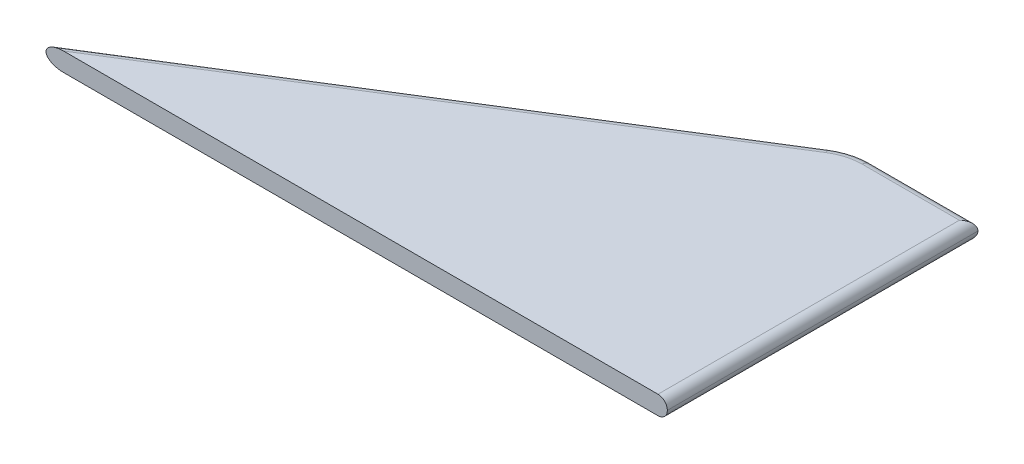
ISO-10303-21;
HEADER;
FILE_DESCRIPTION(('STEP AP214'),'2;1');
FILE_NAME('part.step','',(''),(''),'','','');
FILE_SCHEMA(('AUTOMOTIVE_DESIGN { 1 0 10303 214 1 1 1 1 }'));
ENDSEC;
DATA;
#1=APPLICATION_CONTEXT('core data for automotive mechanical design processes');
#2=APPLICATION_PROTOCOL_DEFINITION('international standard','automotive_design',2000,#1);
#3=PRODUCT_CONTEXT('',#1,'mechanical');
#4=PRODUCT('Part','Part','',(#3));
#5=PRODUCT_RELATED_PRODUCT_CATEGORY('part','',(#4));
#6=PRODUCT_DEFINITION_FORMATION('','',#4);
#7=PRODUCT_DEFINITION_CONTEXT('part definition',#1,'design');
#8=PRODUCT_DEFINITION('design','',#6,#7);
#9=PRODUCT_DEFINITION_SHAPE('','',#8);
#10=(LENGTH_UNIT() NAMED_UNIT(*) SI_UNIT(.MILLI.,.METRE.));
#11=(NAMED_UNIT(*) PLANE_ANGLE_UNIT() SI_UNIT($,.RADIAN.));
#12=(NAMED_UNIT(*) SI_UNIT($,.STERADIAN.) SOLID_ANGLE_UNIT());
#13=UNCERTAINTY_MEASURE_WITH_UNIT(LENGTH_MEASURE(1.E-05),#10,'distance_accuracy_value','');
#14=(GEOMETRIC_REPRESENTATION_CONTEXT(3) GLOBAL_UNCERTAINTY_ASSIGNED_CONTEXT((#13)) GLOBAL_UNIT_ASSIGNED_CONTEXT((#10,
#11,#12)) REPRESENTATION_CONTEXT('',''));
#15=CARTESIAN_POINT('',(0.,0.,0.));
#16=DIRECTION('',(0.,0.,1.));
#17=DIRECTION('',(1.,0.,0.));
#18=AXIS2_PLACEMENT_3D('',#15,#16,#17);
#19=CARTESIAN_POINT('',(0.,3.,0.));
#20=DIRECTION('',(0.,0.,-1.));
#21=DIRECTION('',(-1.,0.,0.));
#22=AXIS2_PLACEMENT_3D('',#19,#20,#21);
#23=PLANE('',#22);
#24=CARTESIAN_POINT('',(98.5,1.5,0.));
#25=DIRECTION('',(0.,0.,-1.));
#26=DIRECTION('',(-1.,0.,0.));
#27=AXIS2_PLACEMENT_3D('',#24,#25,#26);
#28=CIRCLE('',#27,1.5);
#29=CARTESIAN_POINT('',(98.5,0.,0.));
#30=VERTEX_POINT('',#29);
#31=CARTESIAN_POINT('',(100.,1.5,0.));
#32=VERTEX_POINT('',#31);
#33=EDGE_CURVE('E45',#30,#32,#28,.F.);
#34=ORIENTED_EDGE('',*,*,#33,.T.);
#35=CARTESIAN_POINT('',(98.5,1.5,0.));
#36=DIRECTION('',(0.,0.,-1.));
#37=DIRECTION('',(-1.,0.,0.));
#38=AXIS2_PLACEMENT_3D('',#35,#36,#37);
#39=CIRCLE('',#38,1.5);
#40=CARTESIAN_POINT('',(98.5,3.,0.));
#41=VERTEX_POINT('',#40);
#42=EDGE_CURVE('E11',#32,#41,#39,.F.);
#43=ORIENTED_EDGE('',*,*,#42,.T.);
#44=DIRECTION('',(1.,0.,0.));
#45=VECTOR('',#44,1.);
#46=CARTESIAN_POINT('',(0.,3.,0.));
#47=LINE('',#46,#45);
#48=CARTESIAN_POINT('',(2.83019433961698,3.,0.));
#49=VERTEX_POINT('',#48);
#50=EDGE_CURVE('E114',#49,#41,#47,.T.);
#51=ORIENTED_EDGE('',*,*,#50,.F.);
#52=CARTESIAN_POINT('',(2.83019433961698,1.5,0.));
#53=DIRECTION('',(0.,0.,-1.));
#54=DIRECTION('',(-1.,0.,0.));
#55=AXIS2_PLACEMENT_3D('',#52,#53,#54);
#56=ELLIPSE('',#55,2.83019433961698,1.5);
#57=CARTESIAN_POINT('',(0.,1.5,0.));
#58=VERTEX_POINT('',#57);
#59=EDGE_CURVE('E54',#49,#58,#56,.F.);
#60=ORIENTED_EDGE('',*,*,#59,.T.);
#61=CARTESIAN_POINT('',(2.83019433961698,1.5,0.));
#62=DIRECTION('',(0.,0.,-1.));
#63=DIRECTION('',(1.,0.,0.));
#64=AXIS2_PLACEMENT_3D('',#61,#62,#63);
#65=ELLIPSE('',#64,2.83019433961698,1.5);
#66=CARTESIAN_POINT('',(2.83019433961698,0.,0.));
#67=VERTEX_POINT('',#66);
#68=EDGE_CURVE('E81',#58,#67,#65,.F.);
#69=ORIENTED_EDGE('',*,*,#68,.T.);
#70=DIRECTION('',(1.,0.,0.));
#71=VECTOR('',#70,1.);
#72=CARTESIAN_POINT('',(0.,0.,0.));
#73=LINE('',#72,#71);
#74=EDGE_CURVE('E153',#67,#30,#73,.T.);
#75=ORIENTED_EDGE('',*,*,#74,.T.);
#76=EDGE_LOOP('',(#34,#43,#51,#60,#69,#75));
#77=FACE_BOUND('',#76,.T.);
#78=ADVANCED_FACE('F35',(#77),#23,.F.);
#79=CARTESIAN_POINT('',(0.,3.,0.));
#80=DIRECTION('',(0.,-1.,0.));
#81=DIRECTION('',(0.,0.,-1.));
#82=AXIS2_PLACEMENT_3D('',#79,#80,#81);
#83=PLANE('',#82);
#84=ORIENTED_EDGE('',*,*,#50,.T.);
#85=DIRECTION('',(0.,0.,-1.));
#86=VECTOR('',#85,1.);
#87=CARTESIAN_POINT('',(98.5,3.,0.));
#88=LINE('',#87,#86);
#89=CARTESIAN_POINT('',(98.5,3.,-48.5));
#90=VERTEX_POINT('',#89);
#91=EDGE_CURVE('E109',#41,#90,#88,.T.);
#92=ORIENTED_EDGE('',*,*,#91,.T.);
#93=DIRECTION('',(-1.,0.,0.));
#94=VECTOR('',#93,1.);
#95=CARTESIAN_POINT('',(0.,3.,-48.5));
#96=LINE('',#95,#94);
#97=CARTESIAN_POINT('',(82.8679622641132,3.,-48.5));
#98=VERTEX_POINT('',#97);
#99=EDGE_CURVE('E112',#90,#98,#96,.T.);
#100=ORIENTED_EDGE('',*,*,#99,.T.);
#101=CARTESIAN_POINT('',(82.8679622641132,3.,-40.));
#102=DIRECTION('',(0.,-1.,0.));
#103=DIRECTION('',(0.,0.,-1.));
#104=AXIS2_PLACEMENT_3D('',#101,#102,#103);
#105=CIRCLE('',#104,8.5);
#106=CARTESIAN_POINT('',(78.3629712740862,3.,-47.2079855840432));
#107=VERTEX_POINT('',#106);
#108=EDGE_CURVE('E125',#98,#107,#105,.F.);
#109=ORIENTED_EDGE('',*,*,#108,.T.);
#110=DIRECTION('',(-0.847998304005088,0.,0.52999894000318));
#111=VECTOR('',#110,1.);
#112=CARTESIAN_POINT('',(0.794998410004771,3.,1.27199745600763));
#113=LINE('',#112,#111);
#114=EDGE_CURVE('E127',#107,#49,#113,.T.);
#115=ORIENTED_EDGE('',*,*,#114,.T.);
#116=EDGE_LOOP('',(#84,#92,#100,#109,#115));
#117=FACE_BOUND('',#116,.T.);
#118=ADVANCED_FACE('F110',(#117),#83,.F.);
#119=CARTESIAN_POINT('',(0.,0.,0.));
#120=DIRECTION('',(0.,-1.,0.));
#121=DIRECTION('',(0.,0.,-1.));
#122=AXIS2_PLACEMENT_3D('',#119,#120,#121);
#123=PLANE('',#122);
#124=DIRECTION('',(-1.,0.,0.));
#125=VECTOR('',#124,1.);
#126=CARTESIAN_POINT('',(100.,0.,-48.5));
#127=LINE('',#126,#125);
#128=CARTESIAN_POINT('',(82.8679622641132,0.,-48.5));
#129=VERTEX_POINT('',#128);
#130=CARTESIAN_POINT('',(98.5,0.,-48.5));
#131=VERTEX_POINT('',#130);
#132=EDGE_CURVE('E163',#129,#131,#127,.F.);
#133=ORIENTED_EDGE('',*,*,#132,.T.);
#134=DIRECTION('',(0.,0.,-1.));
#135=VECTOR('',#134,1.);
#136=CARTESIAN_POINT('',(98.5,0.,0.));
#137=LINE('',#136,#135);
#138=EDGE_CURVE('E166',#131,#30,#137,.F.);
#139=ORIENTED_EDGE('',*,*,#138,.T.);
#140=ORIENTED_EDGE('',*,*,#74,.F.);
#141=DIRECTION('',(-0.847998304005088,0.,0.52999894000318));
#142=VECTOR('',#141,1.);
#143=CARTESIAN_POINT('',(78.3629712740862,0.,-47.2079855840432));
#144=LINE('',#143,#142);
#145=CARTESIAN_POINT('',(78.3629712740862,0.,-47.2079855840432));
#146=VERTEX_POINT('',#145);
#147=EDGE_CURVE('E157',#67,#146,#144,.F.);
#148=ORIENTED_EDGE('',*,*,#147,.T.);
#149=CARTESIAN_POINT('',(82.8679622641132,0.,-40.));
#150=DIRECTION('',(0.,-1.,0.));
#151=DIRECTION('',(0.,0.,-1.));
#152=AXIS2_PLACEMENT_3D('',#149,#150,#151);
#153=CIRCLE('',#152,8.5);
#154=EDGE_CURVE('E161',#146,#129,#153,.T.);
#155=ORIENTED_EDGE('',*,*,#154,.T.);
#156=EDGE_LOOP('',(#133,#139,#140,#148,#155));
#157=FACE_BOUND('',#156,.T.);
#158=ADVANCED_FACE('F171',(#157),#123,.T.);
#159=CARTESIAN_POINT('',(0.794998410004771,1.5,1.27199745600763));
#160=DIRECTION('',(-0.847998304005088,0.,0.52999894000318));
#161=DIRECTION('',(0.52999894000318,0.,0.847998304005088));
#162=AXIS2_PLACEMENT_3D('',#159,#160,#161);
#163=CYLINDRICAL_SURFACE('',#162,1.5);
#164=ORIENTED_EDGE('',*,*,#59,.F.);
#165=ORIENTED_EDGE('',*,*,#114,.F.);
#166=CARTESIAN_POINT('',(78.3629712740862,1.5,-47.2079855840432));
#167=DIRECTION('',(0.847998304005087,0.,-0.529998940003181));
#168=DIRECTION('',(-0.529998940003181,0.,-0.847998304005088));
#169=AXIS2_PLACEMENT_3D('',#166,#167,#168);
#170=CIRCLE('',#169,1.5);
#171=CARTESIAN_POINT('',(77.5679728640814,1.5,-48.4799830400509));
#172=VERTEX_POINT('',#171);
#173=EDGE_CURVE('E39',#172,#107,#170,.T.);
#174=ORIENTED_EDGE('',*,*,#173,.F.);
#175=DIRECTION('',(-0.847998304005088,0.,0.52999894000318));
#176=VECTOR('',#175,1.);
#177=CARTESIAN_POINT('',(80.,1.5,-50.));
#178=LINE('',#177,#176);
#179=EDGE_CURVE('E149',#58,#172,#178,.F.);
#180=ORIENTED_EDGE('',*,*,#179,.F.);
#181=EDGE_LOOP('',(#164,#165,#174,#180));
#182=FACE_BOUND('',#181,.T.);
#183=ADVANCED_FACE('F37',(#182),#163,.T.);
#184=CARTESIAN_POINT('',(98.5,1.5,0.));
#185=DIRECTION('',(0.,0.,-1.));
#186=DIRECTION('',(-1.,0.,0.));
#187=AXIS2_PLACEMENT_3D('',#184,#185,#186);
#188=CYLINDRICAL_SURFACE('',#187,1.5);
#189=ORIENTED_EDGE('',*,*,#91,.F.);
#190=ORIENTED_EDGE('',*,*,#42,.F.);
#191=DIRECTION('',(0.,0.,-1.));
#192=VECTOR('',#191,1.);
#193=CARTESIAN_POINT('',(100.,1.5,0.));
#194=LINE('',#193,#192);
#195=CARTESIAN_POINT('',(100.,1.5,-50.));
#196=VERTEX_POINT('',#195);
#197=EDGE_CURVE('E69',#196,#32,#194,.F.);
#198=ORIENTED_EDGE('',*,*,#197,.F.);
#199=CARTESIAN_POINT('',(98.5,1.5,-48.5));
#200=DIRECTION('',(-0.707106781186547,0.,-0.707106781186547));
#201=DIRECTION('',(0.707106781186547,0.,-0.707106781186547));
#202=AXIS2_PLACEMENT_3D('',#199,#200,#201);
#203=ELLIPSE('',#202,2.12132034355964,1.5);
#204=EDGE_CURVE('E116',#90,#196,#203,.T.);
#205=ORIENTED_EDGE('',*,*,#204,.F.);
#206=EDGE_LOOP('',(#189,#190,#198,#205));
#207=FACE_BOUND('',#206,.T.);
#208=ADVANCED_FACE('F117',(#207),#188,.T.);
#209=CARTESIAN_POINT('',(82.8679622641132,1.5,-40.));
#210=DIRECTION('',(0.,-1.,0.));
#211=DIRECTION('',(0.,0.,-1.));
#212=AXIS2_PLACEMENT_3D('',#209,#210,#211);
#213=TOROIDAL_SURFACE('',#212,8.5,1.5);
#214=ORIENTED_EDGE('',*,*,#173,.T.);
#215=ORIENTED_EDGE('',*,*,#108,.F.);
#216=CARTESIAN_POINT('',(82.8679622641132,1.5,-48.5));
#217=DIRECTION('',(1.,0.,0.));
#218=DIRECTION('',(0.,0.,-1.));
#219=AXIS2_PLACEMENT_3D('',#216,#217,#218);
#220=CIRCLE('',#219,1.5);
#221=CARTESIAN_POINT('',(82.8679622641132,1.5,-50.));
#222=VERTEX_POINT('',#221);
#223=EDGE_CURVE('E121',#222,#98,#220,.T.);
#224=ORIENTED_EDGE('',*,*,#223,.F.);
#225=CARTESIAN_POINT('',(82.8679622641132,1.5,-40.));
#226=DIRECTION('',(0.,-1.,0.));
#227=DIRECTION('',(0.,0.,-1.));
#228=AXIS2_PLACEMENT_3D('',#225,#226,#227);
#229=CIRCLE('',#228,10.);
#230=EDGE_CURVE('E145',#172,#222,#229,.T.);
#231=ORIENTED_EDGE('',*,*,#230,.F.);
#232=EDGE_LOOP('',(#214,#215,#224,#231));
#233=FACE_BOUND('',#232,.T.);
#234=ADVANCED_FACE('F181',(#233),#213,.T.);
#235=CARTESIAN_POINT('',(80.7949984100048,1.5,-48.7280025439924));
#236=DIRECTION('',(0.847998304005088,0.,-0.52999894000318));
#237=DIRECTION('',(-0.52999894000318,0.,-0.847998304005088));
#238=AXIS2_PLACEMENT_3D('',#235,#236,#237);
#239=CYLINDRICAL_SURFACE('',#238,1.5);
#240=ORIENTED_EDGE('',*,*,#68,.F.);
#241=ORIENTED_EDGE('',*,*,#179,.T.);
#242=CARTESIAN_POINT('',(78.3629712740862,1.5,-47.2079855840432));
#243=DIRECTION('',(0.847998304005087,0.,-0.529998940003181));
#244=DIRECTION('',(-0.529998940003181,0.,-0.847998304005088));
#245=AXIS2_PLACEMENT_3D('',#242,#243,#244);
#246=CIRCLE('',#245,1.5);
#247=EDGE_CURVE('E142',#146,#172,#246,.T.);
#248=ORIENTED_EDGE('',*,*,#247,.F.);
#249=ORIENTED_EDGE('',*,*,#147,.F.);
#250=EDGE_LOOP('',(#240,#241,#248,#249));
#251=FACE_BOUND('',#250,.T.);
#252=ADVANCED_FACE('F168',(#251),#239,.T.);
#253=CARTESIAN_POINT('',(98.5,1.5,0.));
#254=DIRECTION('',(0.,0.,1.));
#255=DIRECTION('',(1.,0.,0.));
#256=AXIS2_PLACEMENT_3D('',#253,#254,#255);
#257=CYLINDRICAL_SURFACE('',#256,1.5);
#258=ORIENTED_EDGE('',*,*,#33,.F.);
#259=ORIENTED_EDGE('',*,*,#138,.F.);
#260=CARTESIAN_POINT('',(98.5,1.5,-48.5));
#261=DIRECTION('',(0.707106781186547,0.,0.707106781186547));
#262=DIRECTION('',(-0.707106781186547,0.,0.707106781186547));
#263=AXIS2_PLACEMENT_3D('',#260,#261,#262);
#264=ELLIPSE('',#263,2.12132034355964,1.5);
#265=EDGE_CURVE('E140',#196,#131,#264,.F.);
#266=ORIENTED_EDGE('',*,*,#265,.F.);
#267=ORIENTED_EDGE('',*,*,#197,.T.);
#268=EDGE_LOOP('',(#258,#259,#266,#267));
#269=FACE_BOUND('',#268,.T.);
#270=ADVANCED_FACE('F175',(#269),#257,.T.);
#271=CARTESIAN_POINT('',(0.,1.5,-48.5));
#272=DIRECTION('',(-1.,0.,0.));
#273=DIRECTION('',(0.,0.,1.));
#274=AXIS2_PLACEMENT_3D('',#271,#272,#273);
#275=CYLINDRICAL_SURFACE('',#274,1.5);
#276=ORIENTED_EDGE('',*,*,#99,.F.);
#277=ORIENTED_EDGE('',*,*,#204,.T.);
#278=DIRECTION('',(-1.,0.,0.));
#279=VECTOR('',#278,1.);
#280=CARTESIAN_POINT('',(100.,1.5,-50.));
#281=LINE('',#280,#279);
#282=EDGE_CURVE('E137',#222,#196,#281,.F.);
#283=ORIENTED_EDGE('',*,*,#282,.F.);
#284=ORIENTED_EDGE('',*,*,#223,.T.);
#285=EDGE_LOOP('',(#276,#277,#283,#284));
#286=FACE_BOUND('',#285,.T.);
#287=ADVANCED_FACE('F124',(#286),#275,.T.);
#288=CARTESIAN_POINT('',(82.8679622641132,1.5,-40.));
#289=DIRECTION('',(0.,-1.,0.));
#290=DIRECTION('',(0.,0.,-1.));
#291=AXIS2_PLACEMENT_3D('',#288,#289,#290);
#292=TOROIDAL_SURFACE('',#291,8.5,1.5);
#293=ORIENTED_EDGE('',*,*,#247,.T.);
#294=ORIENTED_EDGE('',*,*,#230,.T.);
#295=CARTESIAN_POINT('',(82.8679622641132,1.5,-48.5));
#296=DIRECTION('',(1.,0.,0.));
#297=DIRECTION('',(0.,0.,-1.));
#298=AXIS2_PLACEMENT_3D('',#295,#296,#297);
#299=CIRCLE('',#298,1.5);
#300=EDGE_CURVE('E134',#129,#222,#299,.T.);
#301=ORIENTED_EDGE('',*,*,#300,.F.);
#302=ORIENTED_EDGE('',*,*,#154,.F.);
#303=EDGE_LOOP('',(#293,#294,#301,#302));
#304=FACE_BOUND('',#303,.T.);
#305=ADVANCED_FACE('F180',(#304),#292,.T.);
#306=CARTESIAN_POINT('',(100.,1.5,-48.5));
#307=DIRECTION('',(1.,0.,0.));
#308=DIRECTION('',(0.,0.,-1.));
#309=AXIS2_PLACEMENT_3D('',#306,#307,#308);
#310=CYLINDRICAL_SURFACE('',#309,1.5);
#311=ORIENTED_EDGE('',*,*,#265,.T.);
#312=ORIENTED_EDGE('',*,*,#132,.F.);
#313=ORIENTED_EDGE('',*,*,#300,.T.);
#314=ORIENTED_EDGE('',*,*,#282,.T.);
#315=EDGE_LOOP('',(#311,#312,#313,#314));
#316=FACE_BOUND('',#315,.T.);
#317=ADVANCED_FACE('F177',(#316),#310,.T.);
#318=CLOSED_SHELL('',(#78,#118,#158,#183,#208,#234,#252,#270,#287,#305,#317));
#319=MANIFOLD_SOLID_BREP('B2',#318);
#320=ADVANCED_BREP_SHAPE_REPRESENTATION('',(#18,#319),#14);
#321=SHAPE_DEFINITION_REPRESENTATION(#9,#320);
ENDSEC;
END-ISO-10303-21;
